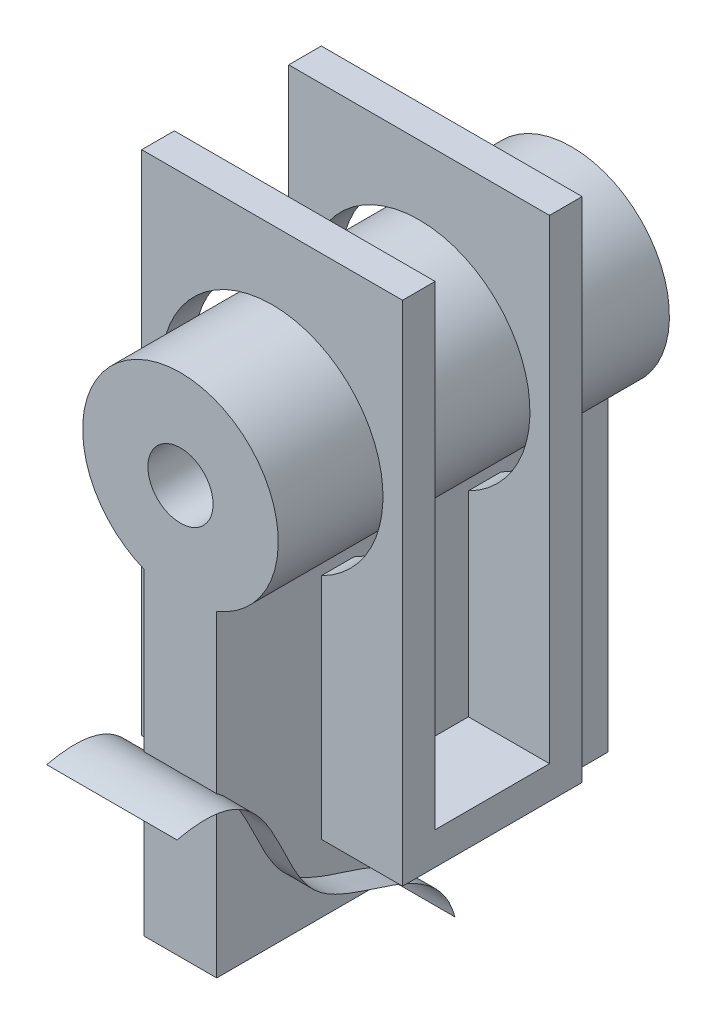
ISO-10303-21;
HEADER;
FILE_DESCRIPTION(('STEP AP214'),'2;1');
FILE_NAME('part.step','',(''),(''),'','','');
FILE_SCHEMA(('AUTOMOTIVE_DESIGN { 1 0 10303 214 1 1 1 1 }'));
ENDSEC;
DATA;
#1=APPLICATION_CONTEXT('core data for automotive mechanical design processes');
#2=APPLICATION_PROTOCOL_DEFINITION('international standard','automotive_design',2000,#1);
#3=PRODUCT_CONTEXT('',#1,'mechanical');
#4=PRODUCT('Part','Part','',(#3));
#5=PRODUCT_RELATED_PRODUCT_CATEGORY('part','',(#4));
#6=PRODUCT_DEFINITION_FORMATION('','',#4);
#7=PRODUCT_DEFINITION_CONTEXT('part definition',#1,'design');
#8=PRODUCT_DEFINITION('design','',#6,#7);
#9=PRODUCT_DEFINITION_SHAPE('','',#8);
#10=(LENGTH_UNIT() NAMED_UNIT(*) SI_UNIT(.MILLI.,.METRE.));
#11=(NAMED_UNIT(*) PLANE_ANGLE_UNIT() SI_UNIT($,.RADIAN.));
#12=(NAMED_UNIT(*) SI_UNIT($,.STERADIAN.) SOLID_ANGLE_UNIT());
#13=UNCERTAINTY_MEASURE_WITH_UNIT(LENGTH_MEASURE(1.E-05),#10,'distance_accuracy_value','');
#14=(GEOMETRIC_REPRESENTATION_CONTEXT(3) GLOBAL_UNCERTAINTY_ASSIGNED_CONTEXT((#13)) GLOBAL_UNIT_ASSIGNED_CONTEXT((#10,
#11,#12)) REPRESENTATION_CONTEXT('',''));
#15=CARTESIAN_POINT('',(0.,0.,0.));
#16=DIRECTION('',(0.,0.,1.));
#17=DIRECTION('',(1.,0.,0.));
#18=AXIS2_PLACEMENT_3D('',#15,#16,#17);
#19=CARTESIAN_POINT('',(-20.,-45.2531458099855,-6.6055019568257));
#20=DIRECTION('',(0.,1.,0.));
#21=DIRECTION('',(0.,0.,1.));
#22=AXIS2_PLACEMENT_3D('',#19,#20,#21);
#23=PLANE('',#22);
#24=DIRECTION('',(0.,0.,-1.));
#25=VECTOR('',#24,1.);
#26=CARTESIAN_POINT('',(7.5576064521285,-45.2531458099855,-6.6055019568257));
#27=LINE('',#26,#25);
#28=CARTESIAN_POINT('',(7.5576064521285,-45.2531458099855,10.9381302617935));
#29=VERTEX_POINT('',#28);
#30=CARTESIAN_POINT('',(7.5576064521285,-45.2531458099855,-6.6055019568257));
#31=VERTEX_POINT('',#30);
#32=EDGE_CURVE('E173',#29,#31,#27,.T.);
#33=ORIENTED_EDGE('',*,*,#32,.F.);
#34=DIRECTION('',(1.,0.,0.));
#35=VECTOR('',#34,1.);
#36=CARTESIAN_POINT('',(-20.,-45.2531458099855,10.9381302617935));
#37=LINE('',#36,#35);
#38=CARTESIAN_POINT('',(20.,-45.2531458099855,10.9381302617935));
#39=VERTEX_POINT('',#38);
#40=EDGE_CURVE('E221',#29,#39,#37,.T.);
#41=ORIENTED_EDGE('',*,*,#40,.T.);
#42=DIRECTION('',(0.,0.,1.));
#43=VECTOR('',#42,1.);
#44=CARTESIAN_POINT('',(20.,-45.2531458099855,-6.6055019568257));
#45=LINE('',#44,#43);
#46=CARTESIAN_POINT('',(20.,-45.2531458099855,-6.6055019568257));
#47=VERTEX_POINT('',#46);
#48=EDGE_CURVE('E189',#47,#39,#45,.T.);
#49=ORIENTED_EDGE('',*,*,#48,.F.);
#50=DIRECTION('',(1.,0.,0.));
#51=VECTOR('',#50,1.);
#52=CARTESIAN_POINT('',(-20.,-45.2531458099855,-6.6055019568257));
#53=LINE('',#52,#51);
#54=EDGE_CURVE('E219',#31,#47,#53,.T.);
#55=ORIENTED_EDGE('',*,*,#54,.F.);
#56=EDGE_LOOP('',(#33,#41,#49,#55));
#57=FACE_BOUND('',#56,.T.);
#58=ADVANCED_FACE('F49',(#57),#23,.T.);
#59=CARTESIAN_POINT('',(-20.,-50.2531458099855,-11.6055019568257));
#60=DIRECTION('',(0.,-1.,0.));
#61=DIRECTION('',(0.,0.,-1.));
#62=AXIS2_PLACEMENT_3D('',#59,#60,#61);
#63=PLANE('',#62);
#64=DIRECTION('',(0.,0.,1.));
#65=VECTOR('',#64,1.);
#66=CARTESIAN_POINT('',(7.5576064521285,-50.2531458099855,-11.6055019568257));
#67=LINE('',#66,#65);
#68=CARTESIAN_POINT('',(7.5576064521285,-50.2531458099855,-11.6055019568257));
#69=VERTEX_POINT('',#68);
#70=CARTESIAN_POINT('',(7.5576064521285,-50.2531458099855,15.9381302617935));
#71=VERTEX_POINT('',#70);
#72=EDGE_CURVE('E196',#69,#71,#67,.T.);
#73=ORIENTED_EDGE('',*,*,#72,.F.);
#74=DIRECTION('',(1.,0.,0.));
#75=VECTOR('',#74,1.);
#76=CARTESIAN_POINT('',(-20.,-50.2531458099855,-11.6055019568257));
#77=LINE('',#76,#75);
#78=CARTESIAN_POINT('',(20.,-50.2531458099855,-11.6055019568257));
#79=VERTEX_POINT('',#78);
#80=EDGE_CURVE('E237',#69,#79,#77,.T.);
#81=ORIENTED_EDGE('',*,*,#80,.T.);
#82=DIRECTION('',(0.,0.,-1.));
#83=VECTOR('',#82,1.);
#84=CARTESIAN_POINT('',(20.,-50.2531458099855,-11.6055019568257));
#85=LINE('',#84,#83);
#86=CARTESIAN_POINT('',(20.,-50.2531458099855,15.9381302617935));
#87=VERTEX_POINT('',#86);
#88=EDGE_CURVE('E271',#87,#79,#85,.T.);
#89=ORIENTED_EDGE('',*,*,#88,.F.);
#90=DIRECTION('',(1.,0.,0.));
#91=VECTOR('',#90,1.);
#92=CARTESIAN_POINT('',(-20.,-50.2531458099855,15.9381302617935));
#93=LINE('',#92,#91);
#94=EDGE_CURVE('E232',#71,#87,#93,.T.);
#95=ORIENTED_EDGE('',*,*,#94,.F.);
#96=EDGE_LOOP('',(#73,#81,#89,#95));
#97=FACE_BOUND('',#96,.T.);
#98=ADVANCED_FACE('F312',(#97),#63,.T.);
#99=DIRECTION('',(0.,0.,1.));
#100=VECTOR('',#99,1.);
#101=CARTESIAN_POINT('',(-7.5576064521285,-45.2531458099855,-6.6055019568257));
#102=LINE('',#101,#100);
#103=CARTESIAN_POINT('',(-7.5576064521285,-45.2531458099855,-6.6055019568257));
#104=VERTEX_POINT('',#103);
#105=CARTESIAN_POINT('',(-7.5576064521285,-45.2531458099855,10.9381302617935));
#106=VERTEX_POINT('',#105);
#107=EDGE_CURVE('E97',#104,#106,#102,.T.);
#108=ORIENTED_EDGE('',*,*,#107,.F.);
#109=CARTESIAN_POINT('',(-20.,-45.2531458099855,-6.6055019568257));
#110=VERTEX_POINT('',#109);
#111=EDGE_CURVE('E244',#110,#104,#53,.T.);
#112=ORIENTED_EDGE('',*,*,#111,.F.);
#113=DIRECTION('',(0.,0.,1.));
#114=VECTOR('',#113,1.);
#115=CARTESIAN_POINT('',(-20.,-45.2531458099855,-6.6055019568257));
#116=LINE('',#115,#114);
#117=CARTESIAN_POINT('',(-20.,-45.2531458099855,10.9381302617935));
#118=VERTEX_POINT('',#117);
#119=EDGE_CURVE('E220',#110,#118,#116,.T.);
#120=ORIENTED_EDGE('',*,*,#119,.T.);
#121=EDGE_CURVE('E216',#118,#106,#37,.T.);
#122=ORIENTED_EDGE('',*,*,#121,.T.);
#123=EDGE_LOOP('',(#108,#112,#120,#122));
#124=FACE_BOUND('',#123,.T.);
#125=ADVANCED_FACE('F322',(#124),#23,.T.);
#126=CARTESIAN_POINT('',(-20.,-45.2531458099855,-6.6055019568257));
#127=DIRECTION('',(0.,0.,1.));
#128=DIRECTION('',(1.,0.,0.));
#129=AXIS2_PLACEMENT_3D('',#126,#127,#128);
#130=PLANE('',#129);
#131=DIRECTION('',(0.,1.,0.));
#132=VECTOR('',#131,1.);
#133=CARTESIAN_POINT('',(7.5576064521285,-45.2531458099855,-6.6055019568257));
#134=LINE('',#133,#132);
#135=CARTESIAN_POINT('',(7.5576064521285,-15.2276913783655,-6.6055019568257));
#136=VERTEX_POINT('',#135);
#137=EDGE_CURVE('E169',#31,#136,#134,.T.);
#138=ORIENTED_EDGE('',*,*,#137,.F.);
#139=ORIENTED_EDGE('',*,*,#54,.T.);
#140=DIRECTION('',(0.,-1.,0.));
#141=VECTOR('',#140,1.);
#142=CARTESIAN_POINT('',(20.,-45.2531458099855,-6.6055019568257));
#143=LINE('',#142,#141);
#144=CARTESIAN_POINT('',(20.,27.5804653060911,-6.6055019568257));
#145=VERTEX_POINT('',#144);
#146=EDGE_CURVE('E207',#145,#47,#143,.T.);
#147=ORIENTED_EDGE('',*,*,#146,.F.);
#148=DIRECTION('',(1.,0.,0.));
#149=VECTOR('',#148,1.);
#150=CARTESIAN_POINT('',(-20.,27.5804653060911,-6.6055019568257));
#151=LINE('',#150,#149);
#152=CARTESIAN_POINT('',(-20.,27.5804653060911,-6.6055019568257));
#153=VERTEX_POINT('',#152);
#154=EDGE_CURVE('E241',#153,#145,#151,.T.);
#155=ORIENTED_EDGE('',*,*,#154,.F.);
#156=DIRECTION('',(0.,-1.,0.));
#157=VECTOR('',#156,1.);
#158=CARTESIAN_POINT('',(-20.,-45.2531458099855,-6.6055019568257));
#159=LINE('',#158,#157);
#160=EDGE_CURVE('E246',#153,#110,#159,.T.);
#161=ORIENTED_EDGE('',*,*,#160,.T.);
#162=ORIENTED_EDGE('',*,*,#111,.T.);
#163=DIRECTION('',(0.,-1.,0.));
#164=VECTOR('',#163,1.);
#165=CARTESIAN_POINT('',(-7.5576064521285,-45.2531458099855,-6.6055019568257));
#166=LINE('',#165,#164);
#167=CARTESIAN_POINT('',(-7.5576064521285,-15.2276913783655,-6.6055019568257));
#168=VERTEX_POINT('',#167);
#169=EDGE_CURVE('E185',#168,#104,#166,.T.);
#170=ORIENTED_EDGE('',*,*,#169,.F.);
#171=CARTESIAN_POINT('',(0.,0.,-6.6055019568257));
#172=DIRECTION('',(0.,0.,1.));
#173=DIRECTION('',(1.,0.,0.));
#174=AXIS2_PLACEMENT_3D('',#171,#172,#173);
#175=CIRCLE('',#174,17.);
#176=EDGE_CURVE('E180',#136,#168,#175,.T.);
#177=ORIENTED_EDGE('',*,*,#176,.F.);
#178=EDGE_LOOP('',(#138,#139,#147,#155,#161,#162,#170,#177));
#179=FACE_BOUND('',#178,.T.);
#180=ADVANCED_FACE('F183',(#179),#130,.T.);
#181=CARTESIAN_POINT('',(-20.,27.5804653060911,-6.6055019568257));
#182=DIRECTION('',(0.,1.,0.));
#183=DIRECTION('',(0.,0.,1.));
#184=AXIS2_PLACEMENT_3D('',#181,#182,#183);
#185=PLANE('',#184);
#186=ORIENTED_EDGE('',*,*,#154,.T.);
#187=DIRECTION('',(0.,0.,1.));
#188=VECTOR('',#187,1.);
#189=CARTESIAN_POINT('',(20.,27.5804653060911,-6.6055019568257));
#190=LINE('',#189,#188);
#191=CARTESIAN_POINT('',(20.,27.5804653060911,-11.6055019568257));
#192=VERTEX_POINT('',#191);
#193=EDGE_CURVE('E265',#192,#145,#190,.T.);
#194=ORIENTED_EDGE('',*,*,#193,.F.);
#195=DIRECTION('',(1.,0.,0.));
#196=VECTOR('',#195,1.);
#197=CARTESIAN_POINT('',(-20.,27.5804653060911,-11.6055019568257));
#198=LINE('',#197,#196);
#199=CARTESIAN_POINT('',(-20.,27.5804653060911,-11.6055019568257));
#200=VERTEX_POINT('',#199);
#201=EDGE_CURVE('E238',#200,#192,#198,.T.);
#202=ORIENTED_EDGE('',*,*,#201,.F.);
#203=DIRECTION('',(0.,0.,1.));
#204=VECTOR('',#203,1.);
#205=CARTESIAN_POINT('',(-20.,27.5804653060911,-6.6055019568257));
#206=LINE('',#205,#204);
#207=EDGE_CURVE('E243',#200,#153,#206,.T.);
#208=ORIENTED_EDGE('',*,*,#207,.T.);
#209=EDGE_LOOP('',(#186,#194,#202,#208));
#210=FACE_BOUND('',#209,.T.);
#211=ADVANCED_FACE('F318',(#210),#185,.T.);
#212=CARTESIAN_POINT('',(-20.,-50.2531458099855,-11.6055019568257));
#213=DIRECTION('',(0.,0.,-1.));
#214=DIRECTION('',(-1.,0.,0.));
#215=AXIS2_PLACEMENT_3D('',#212,#213,#214);
#216=PLANE('',#215);
#217=DIRECTION('',(0.,-1.,0.));
#218=VECTOR('',#217,1.);
#219=CARTESIAN_POINT('',(7.5576064521285,-50.2531458099855,-11.6055019568257));
#220=LINE('',#219,#218);
#221=CARTESIAN_POINT('',(7.5576064521285,-15.2276913783655,-11.6055019568257));
#222=VERTEX_POINT('',#221);
#223=EDGE_CURVE('E194',#222,#69,#220,.T.);
#224=ORIENTED_EDGE('',*,*,#223,.F.);
#225=CARTESIAN_POINT('',(0.,0.,-11.6055019568257));
#226=DIRECTION('',(0.,0.,-1.));
#227=DIRECTION('',(-1.,0.,0.));
#228=AXIS2_PLACEMENT_3D('',#225,#226,#227);
#229=CIRCLE('',#228,17.);
#230=CARTESIAN_POINT('',(-7.5576064521285,-15.2276913783655,-11.6055019568257));
#231=VERTEX_POINT('',#230);
#232=EDGE_CURVE('E59',#231,#222,#229,.T.);
#233=ORIENTED_EDGE('',*,*,#232,.F.);
#234=DIRECTION('',(0.,1.,0.));
#235=VECTOR('',#234,1.);
#236=CARTESIAN_POINT('',(-7.5576064521285,-50.2531458099855,-11.6055019568257));
#237=LINE('',#236,#235);
#238=CARTESIAN_POINT('',(-7.5576064521285,-50.2531458099855,-11.6055019568257));
#239=VERTEX_POINT('',#238);
#240=EDGE_CURVE('E203',#239,#231,#237,.T.);
#241=ORIENTED_EDGE('',*,*,#240,.F.);
#242=CARTESIAN_POINT('',(-20.,-50.2531458099855,-11.6055019568257));
#243=VERTEX_POINT('',#242);
#244=EDGE_CURVE('E233',#243,#239,#77,.T.);
#245=ORIENTED_EDGE('',*,*,#244,.F.);
#246=DIRECTION('',(0.,1.,0.));
#247=VECTOR('',#246,1.);
#248=CARTESIAN_POINT('',(-20.,-50.2531458099855,-11.6055019568257));
#249=LINE('',#248,#247);
#250=EDGE_CURVE('E240',#243,#200,#249,.T.);
#251=ORIENTED_EDGE('',*,*,#250,.T.);
#252=ORIENTED_EDGE('',*,*,#201,.T.);
#253=DIRECTION('',(0.,1.,0.));
#254=VECTOR('',#253,1.);
#255=CARTESIAN_POINT('',(20.,-50.2531458099855,-11.6055019568257));
#256=LINE('',#255,#254);
#257=EDGE_CURVE('E268',#79,#192,#256,.T.);
#258=ORIENTED_EDGE('',*,*,#257,.F.);
#259=ORIENTED_EDGE('',*,*,#80,.F.);
#260=EDGE_LOOP('',(#224,#233,#241,#245,#251,#252,#258,#259));
#261=FACE_BOUND('',#260,.T.);
#262=ADVANCED_FACE('F315',(#261),#216,.T.);
#263=DIRECTION('',(0.,0.,-1.));
#264=VECTOR('',#263,1.);
#265=CARTESIAN_POINT('',(-7.5576064521285,-50.2531458099855,-11.6055019568257));
#266=LINE('',#265,#264);
#267=CARTESIAN_POINT('',(-7.5576064521285,-50.2531458099855,15.9381302617935));
#268=VERTEX_POINT('',#267);
#269=EDGE_CURVE('E197',#268,#239,#266,.T.);
#270=ORIENTED_EDGE('',*,*,#269,.F.);
#271=CARTESIAN_POINT('',(-20.,-50.2531458099855,15.9381302617935));
#272=VERTEX_POINT('',#271);
#273=EDGE_CURVE('E228',#272,#268,#93,.T.);
#274=ORIENTED_EDGE('',*,*,#273,.F.);
#275=DIRECTION('',(0.,0.,-1.));
#276=VECTOR('',#275,1.);
#277=CARTESIAN_POINT('',(-20.,-50.2531458099855,-11.6055019568257));
#278=LINE('',#277,#276);
#279=EDGE_CURVE('E236',#272,#243,#278,.T.);
#280=ORIENTED_EDGE('',*,*,#279,.T.);
#281=ORIENTED_EDGE('',*,*,#244,.T.);
#282=EDGE_LOOP('',(#270,#274,#280,#281));
#283=FACE_BOUND('',#282,.T.);
#284=ADVANCED_FACE('F329',(#283),#63,.T.);
#285=CARTESIAN_POINT('',(-20.,-50.2531458099855,15.9381302617935));
#286=DIRECTION('',(0.,0.,1.));
#287=DIRECTION('',(1.,0.,0.));
#288=AXIS2_PLACEMENT_3D('',#285,#286,#287);
#289=PLANE('',#288);
#290=DIRECTION('',(0.,1.,0.));
#291=VECTOR('',#290,1.);
#292=CARTESIAN_POINT('',(7.5576064521285,-50.2531458099855,15.9381302617935));
#293=LINE('',#292,#291);
#294=CARTESIAN_POINT('',(7.5576064521285,-15.2276913783655,15.9381302617935));
#295=VERTEX_POINT('',#294);
#296=EDGE_CURVE('E199',#71,#295,#293,.T.);
#297=ORIENTED_EDGE('',*,*,#296,.F.);
#298=ORIENTED_EDGE('',*,*,#94,.T.);
#299=DIRECTION('',(0.,-1.,0.));
#300=VECTOR('',#299,1.);
#301=CARTESIAN_POINT('',(20.,-50.2531458099855,15.9381302617935));
#302=LINE('',#301,#300);
#303=CARTESIAN_POINT('',(20.,27.5804653060911,15.9381302617935));
#304=VERTEX_POINT('',#303);
#305=EDGE_CURVE('E274',#304,#87,#302,.T.);
#306=ORIENTED_EDGE('',*,*,#305,.F.);
#307=DIRECTION('',(1.,0.,0.));
#308=VECTOR('',#307,1.);
#309=CARTESIAN_POINT('',(-20.,27.5804653060911,15.9381302617935));
#310=LINE('',#309,#308);
#311=CARTESIAN_POINT('',(-20.,27.5804653060911,15.9381302617935));
#312=VERTEX_POINT('',#311);
#313=EDGE_CURVE('E225',#312,#304,#310,.T.);
#314=ORIENTED_EDGE('',*,*,#313,.F.);
#315=DIRECTION('',(0.,-1.,0.));
#316=VECTOR('',#315,1.);
#317=CARTESIAN_POINT('',(-20.,-50.2531458099855,15.9381302617935));
#318=LINE('',#317,#316);
#319=EDGE_CURVE('E231',#312,#272,#318,.T.);
#320=ORIENTED_EDGE('',*,*,#319,.T.);
#321=ORIENTED_EDGE('',*,*,#273,.T.);
#322=DIRECTION('',(0.,-1.,0.));
#323=VECTOR('',#322,1.);
#324=CARTESIAN_POINT('',(-7.5576064521285,-50.2531458099855,15.9381302617935));
#325=LINE('',#324,#323);
#326=CARTESIAN_POINT('',(-7.5576064521285,-15.2276913783655,15.9381302617935));
#327=VERTEX_POINT('',#326);
#328=EDGE_CURVE('E209',#327,#268,#325,.T.);
#329=ORIENTED_EDGE('',*,*,#328,.F.);
#330=CARTESIAN_POINT('',(0.,0.,15.9381302617935));
#331=DIRECTION('',(0.,0.,1.));
#332=DIRECTION('',(1.,0.,0.));
#333=AXIS2_PLACEMENT_3D('',#330,#331,#332);
#334=CIRCLE('',#333,17.);
#335=EDGE_CURVE('E177',#295,#327,#334,.T.);
#336=ORIENTED_EDGE('',*,*,#335,.F.);
#337=EDGE_LOOP('',(#297,#298,#306,#314,#320,#321,#329,#336));
#338=FACE_BOUND('',#337,.T.);
#339=ADVANCED_FACE('F51',(#338),#289,.T.);
#340=CARTESIAN_POINT('',(-20.,27.5804653060911,15.9381302617935));
#341=DIRECTION('',(0.,1.,0.));
#342=DIRECTION('',(0.,0.,1.));
#343=AXIS2_PLACEMENT_3D('',#340,#341,#342);
#344=PLANE('',#343);
#345=ORIENTED_EDGE('',*,*,#313,.T.);
#346=DIRECTION('',(0.,0.,1.));
#347=VECTOR('',#346,1.);
#348=CARTESIAN_POINT('',(20.,27.5804653060911,15.9381302617935));
#349=LINE('',#348,#347);
#350=CARTESIAN_POINT('',(20.,27.5804653060911,10.9381302617935));
#351=VERTEX_POINT('',#350);
#352=EDGE_CURVE('E277',#351,#304,#349,.T.);
#353=ORIENTED_EDGE('',*,*,#352,.F.);
#354=DIRECTION('',(1.,0.,0.));
#355=VECTOR('',#354,1.);
#356=CARTESIAN_POINT('',(-20.,27.5804653060911,10.9381302617935));
#357=LINE('',#356,#355);
#358=CARTESIAN_POINT('',(-20.,27.5804653060911,10.9381302617935));
#359=VERTEX_POINT('',#358);
#360=EDGE_CURVE('E222',#359,#351,#357,.T.);
#361=ORIENTED_EDGE('',*,*,#360,.F.);
#362=DIRECTION('',(0.,0.,1.));
#363=VECTOR('',#362,1.);
#364=CARTESIAN_POINT('',(-20.,27.5804653060911,15.9381302617935));
#365=LINE('',#364,#363);
#366=EDGE_CURVE('E227',#359,#312,#365,.T.);
#367=ORIENTED_EDGE('',*,*,#366,.T.);
#368=EDGE_LOOP('',(#345,#353,#361,#367));
#369=FACE_BOUND('',#368,.T.);
#370=ADVANCED_FACE('F296',(#369),#344,.T.);
#371=CARTESIAN_POINT('',(-20.,-45.2531458099855,10.9381302617935));
#372=DIRECTION('',(0.,0.,-1.));
#373=DIRECTION('',(-1.,0.,0.));
#374=AXIS2_PLACEMENT_3D('',#371,#372,#373);
#375=PLANE('',#374);
#376=DIRECTION('',(0.,-1.,0.));
#377=VECTOR('',#376,1.);
#378=CARTESIAN_POINT('',(7.5576064521285,-45.2531458099855,10.9381302617935));
#379=LINE('',#378,#377);
#380=CARTESIAN_POINT('',(7.5576064521285,-15.2276913783655,10.9381302617935));
#381=VERTEX_POINT('',#380);
#382=EDGE_CURVE('E200',#381,#29,#379,.T.);
#383=ORIENTED_EDGE('',*,*,#382,.F.);
#384=CARTESIAN_POINT('',(0.,0.,10.9381302617935));
#385=DIRECTION('',(0.,0.,-1.));
#386=DIRECTION('',(-1.,0.,0.));
#387=AXIS2_PLACEMENT_3D('',#384,#385,#386);
#388=CIRCLE('',#387,17.);
#389=CARTESIAN_POINT('',(-7.5576064521285,-15.2276913783655,10.9381302617935));
#390=VERTEX_POINT('',#389);
#391=EDGE_CURVE('E164',#390,#381,#388,.T.);
#392=ORIENTED_EDGE('',*,*,#391,.F.);
#393=DIRECTION('',(0.,1.,0.));
#394=VECTOR('',#393,1.);
#395=CARTESIAN_POINT('',(-7.5576064521285,-45.2531458099855,10.9381302617935));
#396=LINE('',#395,#394);
#397=EDGE_CURVE('E92',#106,#390,#396,.T.);
#398=ORIENTED_EDGE('',*,*,#397,.F.);
#399=ORIENTED_EDGE('',*,*,#121,.F.);
#400=DIRECTION('',(0.,1.,0.));
#401=VECTOR('',#400,1.);
#402=CARTESIAN_POINT('',(-20.,-45.2531458099855,10.9381302617935));
#403=LINE('',#402,#401);
#404=EDGE_CURVE('E224',#118,#359,#403,.T.);
#405=ORIENTED_EDGE('',*,*,#404,.T.);
#406=ORIENTED_EDGE('',*,*,#360,.T.);
#407=DIRECTION('',(0.,1.,0.));
#408=VECTOR('',#407,1.);
#409=CARTESIAN_POINT('',(20.,-45.2531458099855,10.9381302617935));
#410=LINE('',#409,#408);
#411=EDGE_CURVE('E279',#39,#351,#410,.T.);
#412=ORIENTED_EDGE('',*,*,#411,.F.);
#413=ORIENTED_EDGE('',*,*,#40,.F.);
#414=EDGE_LOOP('',(#383,#392,#398,#399,#405,#406,#412,#413));
#415=FACE_BOUND('',#414,.T.);
#416=ADVANCED_FACE('F292',(#415),#375,.T.);
#417=CARTESIAN_POINT('',(-20.,0.,-70.));
#418=DIRECTION('',(-1.,0.,0.));
#419=DIRECTION('',(0.,0.,1.));
#420=AXIS2_PLACEMENT_3D('',#417,#418,#419);
#421=PLANE('',#420);
#422=ORIENTED_EDGE('',*,*,#119,.F.);
#423=ORIENTED_EDGE('',*,*,#160,.F.);
#424=ORIENTED_EDGE('',*,*,#207,.F.);
#425=ORIENTED_EDGE('',*,*,#250,.F.);
#426=ORIENTED_EDGE('',*,*,#279,.F.);
#427=ORIENTED_EDGE('',*,*,#319,.F.);
#428=ORIENTED_EDGE('',*,*,#366,.F.);
#429=ORIENTED_EDGE('',*,*,#404,.F.);
#430=EDGE_LOOP('',(#422,#423,#424,#425,#426,#427,#428,#429));
#431=FACE_BOUND('',#430,.T.);
#432=ADVANCED_FACE('F300',(#431),#421,.T.);
#433=CARTESIAN_POINT('',(20.,0.,-70.));
#434=DIRECTION('',(-1.,0.,0.));
#435=DIRECTION('',(0.,0.,1.));
#436=AXIS2_PLACEMENT_3D('',#433,#434,#435);
#437=PLANE('',#436);
#438=ORIENTED_EDGE('',*,*,#48,.T.);
#439=ORIENTED_EDGE('',*,*,#411,.T.);
#440=ORIENTED_EDGE('',*,*,#352,.T.);
#441=ORIENTED_EDGE('',*,*,#305,.T.);
#442=ORIENTED_EDGE('',*,*,#88,.T.);
#443=ORIENTED_EDGE('',*,*,#257,.T.);
#444=ORIENTED_EDGE('',*,*,#193,.T.);
#445=ORIENTED_EDGE('',*,*,#146,.T.);
#446=EDGE_LOOP('',(#438,#439,#440,#441,#442,#443,#444,#445));
#447=FACE_BOUND('',#446,.T.);
#448=ADVANCED_FACE('F286',(#447),#437,.F.);
#449=CARTESIAN_POINT('',(-7.5576064521285,-13.9324445279089,-30.));
#450=DIRECTION('',(-1.,0.,0.));
#451=DIRECTION('',(0.,0.,1.));
#452=AXIS2_PLACEMENT_3D('',#449,#450,#451);
#453=PLANE('',#452);
#454=ORIENTED_EDGE('',*,*,#240,.T.);
#455=DIRECTION('',(0.,0.,1.));
#456=VECTOR('',#455,1.);
#457=CARTESIAN_POINT('',(-7.5576064521285,-15.2276913783655,-32.));
#458=LINE('',#457,#456);
#459=EDGE_CURVE('E206',#231,#168,#458,.T.);
#460=ORIENTED_EDGE('',*,*,#459,.T.);
#461=ORIENTED_EDGE('',*,*,#169,.T.);
#462=ORIENTED_EDGE('',*,*,#107,.T.);
#463=ORIENTED_EDGE('',*,*,#397,.T.);
#464=EDGE_CURVE('E53',#390,#327,#458,.T.);
#465=ORIENTED_EDGE('',*,*,#464,.T.);
#466=ORIENTED_EDGE('',*,*,#328,.T.);
#467=ORIENTED_EDGE('',*,*,#269,.T.);
#468=EDGE_LOOP('',(#454,#460,#461,#462,#463,#465,#466,#467));
#469=FACE_BOUND('',#468,.T.);
#470=ADVANCED_FACE('F326',(#469),#453,.F.);
#471=CARTESIAN_POINT('',(7.5576064521285,-13.9324445279089,-30.));
#472=DIRECTION('',(1.,0.,0.));
#473=DIRECTION('',(0.,1.,0.));
#474=AXIS2_PLACEMENT_3D('',#471,#472,#473);
#475=PLANE('',#474);
#476=ORIENTED_EDGE('',*,*,#223,.T.);
#477=ORIENTED_EDGE('',*,*,#72,.T.);
#478=ORIENTED_EDGE('',*,*,#296,.T.);
#479=DIRECTION('',(0.,0.,1.));
#480=VECTOR('',#479,1.);
#481=CARTESIAN_POINT('',(7.5576064521285,-15.2276913783655,-32.));
#482=LINE('',#481,#480);
#483=EDGE_CURVE('E60',#381,#295,#482,.T.);
#484=ORIENTED_EDGE('',*,*,#483,.F.);
#485=ORIENTED_EDGE('',*,*,#382,.T.);
#486=ORIENTED_EDGE('',*,*,#32,.T.);
#487=ORIENTED_EDGE('',*,*,#137,.T.);
#488=EDGE_CURVE('E12',#222,#136,#482,.T.);
#489=ORIENTED_EDGE('',*,*,#488,.F.);
#490=EDGE_LOOP('',(#476,#477,#478,#484,#485,#486,#487,#489));
#491=FACE_BOUND('',#490,.T.);
#492=ADVANCED_FACE('F170',(#491),#475,.F.);
#493=CARTESIAN_POINT('',(0.,0.,-30.));
#494=DIRECTION('',(0.,0.,1.));
#495=DIRECTION('',(1.,0.,0.));
#496=AXIS2_PLACEMENT_3D('',#493,#494,#495);
#497=CYLINDRICAL_SURFACE('',#496,17.);
#498=ORIENTED_EDGE('',*,*,#335,.T.);
#499=ORIENTED_EDGE('',*,*,#464,.F.);
#500=ORIENTED_EDGE('',*,*,#391,.T.);
#501=ORIENTED_EDGE('',*,*,#483,.T.);
#502=EDGE_LOOP('',(#498,#499,#500,#501));
#503=FACE_BOUND('',#502,.T.);
#504=ADVANCED_FACE('F324',(#503),#497,.F.);
#505=ORIENTED_EDGE('',*,*,#176,.T.);
#506=ORIENTED_EDGE('',*,*,#459,.F.);
#507=ORIENTED_EDGE('',*,*,#232,.T.);
#508=ORIENTED_EDGE('',*,*,#488,.T.);
#509=EDGE_LOOP('',(#505,#506,#507,#508));
#510=FACE_BOUND('',#509,.T.);
#511=ADVANCED_FACE('F179',(#510),#497,.F.);
#512=CLOSED_SHELL('',(#58,#98,#125,#180,#211,#262,#284,#339,#370,#416,#432,#448,#470,#492,#504,#511));
#513=MANIFOLD_SOLID_BREP('B2',#512);
#514=CARTESIAN_POINT('',(-20.,-45.2531458099855,10.9381302617935));
#515=DIRECTION('',(0.,0.,-1.));
#516=DIRECTION('',(-1.,0.,0.));
#517=AXIS2_PLACEMENT_3D('',#514,#515,#516);
#518=PLANE('',#517);
#519=CARTESIAN_POINT('',(0.,0.,10.9381302617935));
#520=DIRECTION('',(0.,0.,-1.));
#521=DIRECTION('',(-1.,0.,0.));
#522=AXIS2_PLACEMENT_3D('',#519,#520,#521);
#523=CIRCLE('',#522,3.);
#524=CARTESIAN_POINT('',(-3.,0.,10.9381302617935));
#525=VERTEX_POINT('',#524);
#526=EDGE_CURVE('E472',#525,#525,#523,.T.);
#527=ORIENTED_EDGE('',*,*,#526,.T.);
#528=EDGE_LOOP('',(#527));
#529=FACE_BOUND('',#528,.T.);
#530=ADVANCED_FACE('F465',(#529),#518,.T.);
#531=CARTESIAN_POINT('',(0.,0.,-30.));
#532=DIRECTION('',(0.,0.,1.));
#533=DIRECTION('',(1.,0.,0.));
#534=AXIS2_PLACEMENT_3D('',#531,#532,#533);
#535=CYLINDRICAL_SURFACE('',#534,3.);
#536=CARTESIAN_POINT('',(0.,0.,15.9381302617935));
#537=DIRECTION('',(0.,0.,1.));
#538=DIRECTION('',(1.,0.,0.));
#539=AXIS2_PLACEMENT_3D('',#536,#537,#538);
#540=CIRCLE('',#539,3.);
#541=CARTESIAN_POINT('',(3.,0.,15.9381302617935));
#542=VERTEX_POINT('',#541);
#543=EDGE_CURVE('E48',#542,#542,#540,.T.);
#544=ORIENTED_EDGE('',*,*,#543,.F.);
#545=EDGE_LOOP('',(#544));
#546=FACE_BOUND('',#545,.T.);
#547=ORIENTED_EDGE('',*,*,#526,.F.);
#548=EDGE_LOOP('',(#547));
#549=FACE_BOUND('',#548,.T.);
#550=ADVANCED_FACE('F479',(#546,#549),#535,.T.);
#551=CARTESIAN_POINT('',(-20.,-50.2531458099855,15.9381302617935));
#552=DIRECTION('',(0.,0.,1.));
#553=DIRECTION('',(1.,0.,0.));
#554=AXIS2_PLACEMENT_3D('',#551,#552,#553);
#555=PLANE('',#554);
#556=ORIENTED_EDGE('',*,*,#543,.T.);
#557=EDGE_LOOP('',(#556));
#558=FACE_BOUND('',#557,.T.);
#559=ADVANCED_FACE('F467',(#558),#555,.T.);
#560=CLOSED_SHELL('',(#530,#550,#559));
#561=MANIFOLD_SOLID_BREP('B6',#560);
#562=CARTESIAN_POINT('',(0.,-36.8210870869659,40.5237731026121));
#563=CARTESIAN_POINT('',(0.,-33.3118553670702,25.1176072235687));
#564=CARTESIAN_POINT('',(0.,-61.7215890433346,26.7426652328646));
#565=CARTESIAN_POINT('',(0.,-57.8458147883083,0.702636395193637));
#566=CARTESIAN_POINT('',(0.,-68.3475748648418,-2.08737019533879));
#567=B_SPLINE_CURVE_WITH_KNOTS('',3,(#562,#563,#564,#565,#566),.UNSPECIFIED.,.F.,.F.,(4,1,4),
(0.,0.518621459530431,1.),.UNSPECIFIED.);
#568=DIRECTION('',(1.,0.,0.));
#569=VECTOR('',#568,1.);
#570=SURFACE_OF_LINEAR_EXTRUSION('',#567,#569);
#571=CARTESIAN_POINT('',(10.,-36.8210870869659,40.5237731026121));
#572=CARTESIAN_POINT('',(10.,-33.3118553670702,25.1176072235687));
#573=CARTESIAN_POINT('',(10.,-61.7215890433346,26.7426652328646));
#574=CARTESIAN_POINT('',(10.,-57.8458147883083,0.702636395193637));
#575=CARTESIAN_POINT('',(10.,-68.3475748648418,-2.08737019533879));
#576=B_SPLINE_CURVE_WITH_KNOTS('',3,(#571,#572,#573,#574,#575),.UNSPECIFIED.,.F.,.F.,(4,1,4),
(0.,0.518621459530431,1.),.UNSPECIFIED.);
#577=CARTESIAN_POINT('',(10.,-36.8210870869659,40.5237731026121));
#578=VERTEX_POINT('',#577);
#579=CARTESIAN_POINT('',(10.,-68.3475748648418,-2.08737019533879));
#580=VERTEX_POINT('',#579);
#581=EDGE_CURVE('E523',#578,#580,#576,.T.);
#582=ORIENTED_EDGE('',*,*,#581,.F.);
#583=DIRECTION('',(1.,0.,0.));
#584=VECTOR('',#583,1.);
#585=CARTESIAN_POINT('',(0.,-36.8210870869659,40.5237731026121));
#586=LINE('',#585,#584);
#587=CARTESIAN_POINT('',(-10.,-36.8210870869659,40.5237731026121));
#588=VERTEX_POINT('',#587);
#589=EDGE_CURVE('E515',#588,#578,#586,.T.);
#590=ORIENTED_EDGE('',*,*,#589,.F.);
#591=CARTESIAN_POINT('',(-10.,-36.8210870869659,40.5237731026121));
#592=CARTESIAN_POINT('',(-10.,-33.3118553670702,25.1176072235687));
#593=CARTESIAN_POINT('',(-10.,-61.7215890433346,26.7426652328646));
#594=CARTESIAN_POINT('',(-10.,-57.8458147883083,0.702636395193637));
#595=CARTESIAN_POINT('',(-10.,-68.3475748648418,-2.08737019533879));
#596=B_SPLINE_CURVE_WITH_KNOTS('',3,(#591,#592,#593,#594,#595),.UNSPECIFIED.,.F.,.F.,(4,1,4),
(0.,0.518621459530431,1.),.UNSPECIFIED.);
#597=CARTESIAN_POINT('',(-10.,-68.3475748648418,-2.08737019533879));
#598=VERTEX_POINT('',#597);
#599=EDGE_CURVE('E533',#588,#598,#596,.T.);
#600=ORIENTED_EDGE('',*,*,#599,.T.);
#601=DIRECTION('',(1.,0.,0.));
#602=VECTOR('',#601,1.);
#603=CARTESIAN_POINT('',(0.,-68.3475748648418,-2.08737019533879));
#604=LINE('',#603,#602);
#605=EDGE_CURVE('E463',#598,#580,#604,.T.);
#606=ORIENTED_EDGE('',*,*,#605,.T.);
#607=EDGE_LOOP('',(#582,#590,#600,#606));
#608=FACE_BOUND('',#607,.T.);
#609=ADVANCED_FACE('F513',(#608),#570,.T.);
#610=OPEN_SHELL('',(#609));
#611=SHELL_BASED_SURFACE_MODEL('B43',(#610));
#612=CARTESIAN_POINT('',(-20.,-50.2531458099855,-11.6055019568257));
#613=DIRECTION('',(0.,0.,-1.));
#614=DIRECTION('',(-1.,0.,0.));
#615=AXIS2_PLACEMENT_3D('',#612,#613,#614);
#616=PLANE('',#615);
#617=CARTESIAN_POINT('',(0.,0.,-11.6055019568257));
#618=DIRECTION('',(0.,0.,-1.));
#619=DIRECTION('',(-1.,0.,0.));
#620=AXIS2_PLACEMENT_3D('',#617,#618,#619);
#621=CIRCLE('',#620,3.);
#622=CARTESIAN_POINT('',(-3.,0.,-11.6055019568257));
#623=VERTEX_POINT('',#622);
#624=EDGE_CURVE('E588',#623,#623,#621,.T.);
#625=ORIENTED_EDGE('',*,*,#624,.T.);
#626=EDGE_LOOP('',(#625));
#627=FACE_BOUND('',#626,.T.);
#628=ADVANCED_FACE('F582',(#627),#616,.T.);
#629=CARTESIAN_POINT('',(0.,0.,-30.));
#630=DIRECTION('',(0.,0.,1.));
#631=DIRECTION('',(1.,0.,0.));
#632=AXIS2_PLACEMENT_3D('',#629,#630,#631);
#633=CYLINDRICAL_SURFACE('',#632,3.);
#634=CARTESIAN_POINT('',(0.,0.,-6.6055019568257));
#635=DIRECTION('',(0.,0.,1.));
#636=DIRECTION('',(1.,0.,0.));
#637=AXIS2_PLACEMENT_3D('',#634,#635,#636);
#638=CIRCLE('',#637,3.);
#639=CARTESIAN_POINT('',(3.,0.,-6.6055019568257));
#640=VERTEX_POINT('',#639);
#641=EDGE_CURVE('E512',#640,#640,#638,.T.);
#642=ORIENTED_EDGE('',*,*,#641,.F.);
#643=EDGE_LOOP('',(#642));
#644=FACE_BOUND('',#643,.T.);
#645=ORIENTED_EDGE('',*,*,#624,.F.);
#646=EDGE_LOOP('',(#645));
#647=FACE_BOUND('',#646,.T.);
#648=ADVANCED_FACE('F595',(#644,#647),#633,.T.);
#649=CARTESIAN_POINT('',(-20.,-45.2531458099855,-6.6055019568257));
#650=DIRECTION('',(0.,0.,1.));
#651=DIRECTION('',(1.,0.,0.));
#652=AXIS2_PLACEMENT_3D('',#649,#650,#651);
#653=PLANE('',#652);
#654=ORIENTED_EDGE('',*,*,#641,.T.);
#655=EDGE_LOOP('',(#654));
#656=FACE_BOUND('',#655,.T.);
#657=ADVANCED_FACE('F597',(#656),#653,.T.);
#658=CLOSED_SHELL('',(#628,#648,#657));
#659=MANIFOLD_SOLID_BREP('B457',#658);
#660=CARTESIAN_POINT('',(0.,0.,-30.));
#661=DIRECTION('',(0.,0.,1.));
#662=DIRECTION('',(1.,0.,0.));
#663=AXIS2_PLACEMENT_3D('',#660,#661,#662);
#664=CYLINDRICAL_SURFACE('',#663,15.);
#665=DIRECTION('',(0.,0.,1.));
#666=VECTOR('',#665,1.);
#667=CARTESIAN_POINT('',(-5.5576064521285,-13.9324445279089,-30.));
#668=LINE('',#667,#666);
#669=CARTESIAN_POINT('',(-5.5576064521285,-13.9324445279089,-30.));
#670=VERTEX_POINT('',#669);
#671=CARTESIAN_POINT('',(-5.5576064521285,-13.9324445279089,30.));
#672=VERTEX_POINT('',#671);
#673=EDGE_CURVE('E625',#670,#672,#668,.T.);
#674=ORIENTED_EDGE('',*,*,#673,.T.);
#675=CARTESIAN_POINT('',(0.,0.,30.));
#676=DIRECTION('',(0.,0.,1.));
#677=DIRECTION('',(1.,0.,0.));
#678=AXIS2_PLACEMENT_3D('',#675,#676,#677);
#679=CIRCLE('',#678,15.);
#680=CARTESIAN_POINT('',(5.5576064521285,-13.9324445279089,30.));
#681=VERTEX_POINT('',#680);
#682=EDGE_CURVE('E662',#681,#672,#679,.T.);
#683=ORIENTED_EDGE('',*,*,#682,.F.);
#684=DIRECTION('',(0.,0.,1.));
#685=VECTOR('',#684,1.);
#686=CARTESIAN_POINT('',(5.5576064521285,-13.9324445279089,-30.));
#687=LINE('',#686,#685);
#688=CARTESIAN_POINT('',(5.5576064521285,-13.9324445279089,-30.));
#689=VERTEX_POINT('',#688);
#690=EDGE_CURVE('E580',#689,#681,#687,.T.);
#691=ORIENTED_EDGE('',*,*,#690,.F.);
#692=CARTESIAN_POINT('',(0.,0.,-30.));
#693=DIRECTION('',(0.,0.,1.));
#694=DIRECTION('',(1.,0.,0.));
#695=AXIS2_PLACEMENT_3D('',#692,#693,#694);
#696=CIRCLE('',#695,15.);
#697=EDGE_CURVE('E663',#689,#670,#696,.T.);
#698=ORIENTED_EDGE('',*,*,#697,.T.);
#699=EDGE_LOOP('',(#674,#683,#691,#698));
#700=FACE_BOUND('',#699,.T.);
#701=ADVANCED_FACE('F622',(#700),#664,.T.);
#702=CARTESIAN_POINT('',(5.5576064521285,-13.9324445279089,-30.));
#703=DIRECTION('',(1.,0.,0.));
#704=DIRECTION('',(0.,1.,0.));
#705=AXIS2_PLACEMENT_3D('',#702,#703,#704);
#706=PLANE('',#705);
#707=ORIENTED_EDGE('',*,*,#690,.T.);
#708=DIRECTION('',(0.,1.,0.));
#709=VECTOR('',#708,1.);
#710=CARTESIAN_POINT('',(5.5576064521285,-13.9324445279089,30.));
#711=LINE('',#710,#709);
#712=CARTESIAN_POINT('',(5.5576064521285,-62.6422800075539,30.));
#713=VERTEX_POINT('',#712);
#714=EDGE_CURVE('E680',#713,#681,#711,.T.);
#715=ORIENTED_EDGE('',*,*,#714,.F.);
#716=DIRECTION('',(0.,0.,1.));
#717=VECTOR('',#716,1.);
#718=CARTESIAN_POINT('',(5.5576064521285,-62.6422800075539,-30.));
#719=LINE('',#718,#717);
#720=CARTESIAN_POINT('',(5.5576064521285,-62.6422800075539,-30.));
#721=VERTEX_POINT('',#720);
#722=EDGE_CURVE('E630',#721,#713,#719,.T.);
#723=ORIENTED_EDGE('',*,*,#722,.F.);
#724=DIRECTION('',(0.,1.,0.));
#725=VECTOR('',#724,1.);
#726=CARTESIAN_POINT('',(5.5576064521285,-13.9324445279089,-30.));
#727=LINE('',#726,#725);
#728=EDGE_CURVE('E668',#721,#689,#727,.T.);
#729=ORIENTED_EDGE('',*,*,#728,.T.);
#730=EDGE_LOOP('',(#707,#715,#723,#729));
#731=FACE_BOUND('',#730,.T.);
#732=ADVANCED_FACE('F701',(#731),#706,.T.);
#733=CARTESIAN_POINT('',(-5.5576064521285,-62.6422800075539,-30.));
#734=DIRECTION('',(0.,-1.,0.));
#735=DIRECTION('',(0.,0.,-1.));
#736=AXIS2_PLACEMENT_3D('',#733,#734,#735);
#737=PLANE('',#736);
#738=ORIENTED_EDGE('',*,*,#722,.T.);
#739=DIRECTION('',(1.,0.,0.));
#740=VECTOR('',#739,1.);
#741=CARTESIAN_POINT('',(-5.5576064521285,-62.6422800075539,30.));
#742=LINE('',#741,#740);
#743=CARTESIAN_POINT('',(-5.5576064521285,-62.6422800075539,30.));
#744=VERTEX_POINT('',#743);
#745=EDGE_CURVE('E675',#744,#713,#742,.T.);
#746=ORIENTED_EDGE('',*,*,#745,.F.);
#747=DIRECTION('',(0.,0.,1.));
#748=VECTOR('',#747,1.);
#749=CARTESIAN_POINT('',(-5.5576064521285,-62.6422800075539,-30.));
#750=LINE('',#749,#748);
#751=CARTESIAN_POINT('',(-5.5576064521285,-62.6422800075539,-30.));
#752=VERTEX_POINT('',#751);
#753=EDGE_CURVE('E667',#752,#744,#750,.T.);
#754=ORIENTED_EDGE('',*,*,#753,.F.);
#755=DIRECTION('',(1.,0.,0.));
#756=VECTOR('',#755,1.);
#757=CARTESIAN_POINT('',(-5.5576064521285,-62.6422800075539,-30.));
#758=LINE('',#757,#756);
#759=EDGE_CURVE('E694',#752,#721,#758,.T.);
#760=ORIENTED_EDGE('',*,*,#759,.T.);
#761=EDGE_LOOP('',(#738,#746,#754,#760));
#762=FACE_BOUND('',#761,.T.);
#763=ADVANCED_FACE('F698',(#762),#737,.T.);
#764=CARTESIAN_POINT('',(-5.5576064521285,-13.9324445279089,-30.));
#765=DIRECTION('',(-1.,0.,0.));
#766=DIRECTION('',(0.,0.,1.));
#767=AXIS2_PLACEMENT_3D('',#764,#765,#766);
#768=PLANE('',#767);
#769=ORIENTED_EDGE('',*,*,#753,.T.);
#770=DIRECTION('',(0.,-1.,0.));
#771=VECTOR('',#770,1.);
#772=CARTESIAN_POINT('',(-5.5576064521285,-13.9324445279089,30.));
#773=LINE('',#772,#771);
#774=EDGE_CURVE('E670',#672,#744,#773,.T.);
#775=ORIENTED_EDGE('',*,*,#774,.F.);
#776=ORIENTED_EDGE('',*,*,#673,.F.);
#777=DIRECTION('',(0.,-1.,0.));
#778=VECTOR('',#777,1.);
#779=CARTESIAN_POINT('',(-5.5576064521285,-13.9324445279089,-30.));
#780=LINE('',#779,#778);
#781=EDGE_CURVE('E692',#670,#752,#780,.T.);
#782=ORIENTED_EDGE('',*,*,#781,.T.);
#783=EDGE_LOOP('',(#769,#775,#776,#782));
#784=FACE_BOUND('',#783,.T.);
#785=ADVANCED_FACE('F671',(#784),#768,.T.);
#786=CARTESIAN_POINT('',(0.,0.,-30.));
#787=DIRECTION('',(0.,0.,1.));
#788=DIRECTION('',(1.,0.,0.));
#789=AXIS2_PLACEMENT_3D('',#786,#787,#788);
#790=PLANE('',#789);
#791=CARTESIAN_POINT('',(0.,0.,-30.));
#792=DIRECTION('',(0.,0.,1.));
#793=DIRECTION('',(1.,0.,0.));
#794=AXIS2_PLACEMENT_3D('',#791,#792,#793);
#795=CIRCLE('',#794,5.);
#796=CARTESIAN_POINT('',(5.,0.,-30.));
#797=VERTEX_POINT('',#796);
#798=EDGE_CURVE('E688',#797,#797,#795,.T.);
#799=ORIENTED_EDGE('',*,*,#798,.T.);
#800=EDGE_LOOP('',(#799));
#801=FACE_BOUND('',#800,.T.);
#802=ORIENTED_EDGE('',*,*,#697,.F.);
#803=ORIENTED_EDGE('',*,*,#728,.F.);
#804=ORIENTED_EDGE('',*,*,#759,.F.);
#805=ORIENTED_EDGE('',*,*,#781,.F.);
#806=EDGE_LOOP('',(#802,#803,#804,#805));
#807=FACE_BOUND('',#806,.T.);
#808=ADVANCED_FACE('F703',(#801,#807),#790,.F.);
#809=CARTESIAN_POINT('',(0.,0.,-30.));
#810=DIRECTION('',(0.,0.,1.));
#811=DIRECTION('',(1.,0.,0.));
#812=AXIS2_PLACEMENT_3D('',#809,#810,#811);
#813=CYLINDRICAL_SURFACE('',#812,5.);
#814=ORIENTED_EDGE('',*,*,#798,.F.);
#815=EDGE_LOOP('',(#814));
#816=FACE_BOUND('',#815,.T.);
#817=CARTESIAN_POINT('',(0.,0.,30.));
#818=DIRECTION('',(0.,0.,1.));
#819=DIRECTION('',(1.,0.,0.));
#820=AXIS2_PLACEMENT_3D('',#817,#818,#819);
#821=CIRCLE('',#820,5.);
#822=CARTESIAN_POINT('',(5.,0.,30.));
#823=VERTEX_POINT('',#822);
#824=EDGE_CURVE('E681',#823,#823,#821,.T.);
#825=ORIENTED_EDGE('',*,*,#824,.T.);
#826=EDGE_LOOP('',(#825));
#827=FACE_BOUND('',#826,.T.);
#828=ADVANCED_FACE('F705',(#816,#827),#813,.F.);
#829=CARTESIAN_POINT('',(0.,0.,30.));
#830=DIRECTION('',(0.,0.,1.));
#831=DIRECTION('',(1.,0.,0.));
#832=AXIS2_PLACEMENT_3D('',#829,#830,#831);
#833=PLANE('',#832);
#834=ORIENTED_EDGE('',*,*,#682,.T.);
#835=ORIENTED_EDGE('',*,*,#774,.T.);
#836=ORIENTED_EDGE('',*,*,#745,.T.);
#837=ORIENTED_EDGE('',*,*,#714,.T.);
#838=EDGE_LOOP('',(#834,#835,#836,#837));
#839=FACE_BOUND('',#838,.T.);
#840=ORIENTED_EDGE('',*,*,#824,.F.);
#841=EDGE_LOOP('',(#840));
#842=FACE_BOUND('',#841,.T.);
#843=ADVANCED_FACE('F678',(#839,#842),#833,.T.);
#844=CLOSED_SHELL('',(#701,#732,#763,#785,#808,#828,#843));
#845=MANIFOLD_SOLID_BREP('B507',#844);
#846=ADVANCED_BREP_SHAPE_REPRESENTATION('',(#18,#513,#561,#659,#845),#14);
#847=MANIFOLD_SURFACE_SHAPE_REPRESENTATION('',(#18,#611),#14);
#848=SHAPE_REPRESENTATION('',(#18),#14);
#849=SHAPE_DEFINITION_REPRESENTATION(#9,#848);
#850=SHAPE_REPRESENTATION_RELATIONSHIP('','',#848,#846);
#851=SHAPE_REPRESENTATION_RELATIONSHIP('','',#848,#847);
ENDSEC;
END-ISO-10303-21;
